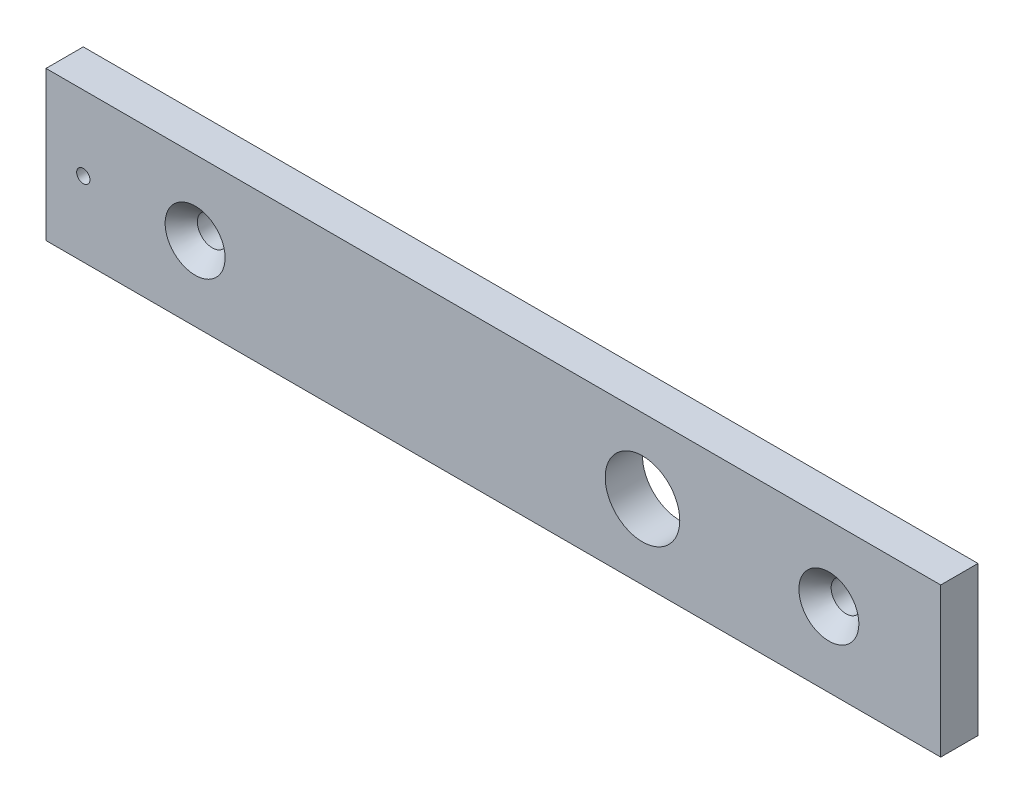
ISO-10303-21;
HEADER;
FILE_DESCRIPTION(('STEP AP214'),'2;1');
FILE_NAME('part.step','',(''),(''),'','','');
FILE_SCHEMA(('AUTOMOTIVE_DESIGN { 1 0 10303 214 1 1 1 1 }'));
ENDSEC;
DATA;
#1=APPLICATION_CONTEXT('core data for automotive mechanical design processes');
#2=APPLICATION_PROTOCOL_DEFINITION('international standard','automotive_design',2000,#1);
#3=PRODUCT_CONTEXT('',#1,'mechanical');
#4=PRODUCT('Part','Part','',(#3));
#5=PRODUCT_RELATED_PRODUCT_CATEGORY('part','',(#4));
#6=PRODUCT_DEFINITION_FORMATION('','',#4);
#7=PRODUCT_DEFINITION_CONTEXT('part definition',#1,'design');
#8=PRODUCT_DEFINITION('design','',#6,#7);
#9=PRODUCT_DEFINITION_SHAPE('','',#8);
#10=(LENGTH_UNIT() NAMED_UNIT(*) SI_UNIT(.MILLI.,.METRE.));
#11=(NAMED_UNIT(*) PLANE_ANGLE_UNIT() SI_UNIT($,.RADIAN.));
#12=(NAMED_UNIT(*) SI_UNIT($,.STERADIAN.) SOLID_ANGLE_UNIT());
#13=UNCERTAINTY_MEASURE_WITH_UNIT(LENGTH_MEASURE(1.E-05),#10,'distance_accuracy_value','');
#14=(GEOMETRIC_REPRESENTATION_CONTEXT(3) GLOBAL_UNCERTAINTY_ASSIGNED_CONTEXT((#13)) GLOBAL_UNIT_ASSIGNED_CONTEXT((#10,
#11,#12)) REPRESENTATION_CONTEXT('',''));
#15=CARTESIAN_POINT('',(0.,0.,0.));
#16=DIRECTION('',(0.,0.,1.));
#17=DIRECTION('',(1.,0.,0.));
#18=AXIS2_PLACEMENT_3D('',#15,#16,#17);
#19=CARTESIAN_POINT('',(-76.2,12.7,6.35));
#20=DIRECTION('',(1.,0.,0.));
#21=DIRECTION('',(0.,0.,-1.));
#22=AXIS2_PLACEMENT_3D('',#19,#20,#21);
#23=PLANE('',#22);
#24=DIRECTION('',(0.,-1.,0.));
#25=VECTOR('',#24,1.);
#26=CARTESIAN_POINT('',(-76.2,12.7,0.));
#27=LINE('',#26,#25);
#28=CARTESIAN_POINT('',(-76.2,12.7,0.));
#29=VERTEX_POINT('',#28);
#30=CARTESIAN_POINT('',(-76.2,-12.7,0.));
#31=VERTEX_POINT('',#30);
#32=EDGE_CURVE('E92',#29,#31,#27,.T.);
#33=ORIENTED_EDGE('',*,*,#32,.T.);
#34=DIRECTION('',(0.,0.,-1.));
#35=VECTOR('',#34,1.);
#36=CARTESIAN_POINT('',(-76.2,-12.7,6.35));
#37=LINE('',#36,#35);
#38=CARTESIAN_POINT('',(-76.2,-12.7,6.35));
#39=VERTEX_POINT('',#38);
#40=EDGE_CURVE('E11',#39,#31,#37,.T.);
#41=ORIENTED_EDGE('',*,*,#40,.F.);
#42=DIRECTION('',(0.,-1.,0.));
#43=VECTOR('',#42,1.);
#44=CARTESIAN_POINT('',(-76.2,12.7,6.35));
#45=LINE('',#44,#43);
#46=CARTESIAN_POINT('',(-76.2,12.7,6.35));
#47=VERTEX_POINT('',#46);
#48=EDGE_CURVE('E103',#47,#39,#45,.T.);
#49=ORIENTED_EDGE('',*,*,#48,.F.);
#50=DIRECTION('',(0.,0.,-1.));
#51=VECTOR('',#50,1.);
#52=CARTESIAN_POINT('',(-76.2,12.7,6.35));
#53=LINE('',#52,#51);
#54=EDGE_CURVE('E108',#47,#29,#53,.T.);
#55=ORIENTED_EDGE('',*,*,#54,.T.);
#56=EDGE_LOOP('',(#33,#41,#49,#55));
#57=FACE_BOUND('',#56,.T.);
#58=ADVANCED_FACE('F31',(#57),#23,.F.);
#59=CARTESIAN_POINT('',(-76.2,-12.7,6.35));
#60=DIRECTION('',(0.,1.,0.));
#61=DIRECTION('',(0.,0.,1.));
#62=AXIS2_PLACEMENT_3D('',#59,#60,#61);
#63=PLANE('',#62);
#64=DIRECTION('',(1.,0.,0.));
#65=VECTOR('',#64,1.);
#66=CARTESIAN_POINT('',(-76.2,-12.7,0.));
#67=LINE('',#66,#65);
#68=CARTESIAN_POINT('',(76.2,-12.7,0.));
#69=VERTEX_POINT('',#68);
#70=EDGE_CURVE('E96',#31,#69,#67,.T.);
#71=ORIENTED_EDGE('',*,*,#70,.T.);
#72=DIRECTION('',(0.,0.,-1.));
#73=VECTOR('',#72,1.);
#74=CARTESIAN_POINT('',(76.2,-12.7,6.35));
#75=LINE('',#74,#73);
#76=CARTESIAN_POINT('',(76.2,-12.7,6.35));
#77=VERTEX_POINT('',#76);
#78=EDGE_CURVE('E39',#77,#69,#75,.T.);
#79=ORIENTED_EDGE('',*,*,#78,.F.);
#80=DIRECTION('',(1.,0.,0.));
#81=VECTOR('',#80,1.);
#82=CARTESIAN_POINT('',(-76.2,-12.7,6.35));
#83=LINE('',#82,#81);
#84=EDGE_CURVE('E78',#39,#77,#83,.T.);
#85=ORIENTED_EDGE('',*,*,#84,.F.);
#86=ORIENTED_EDGE('',*,*,#40,.T.);
#87=EDGE_LOOP('',(#71,#79,#85,#86));
#88=FACE_BOUND('',#87,.T.);
#89=ADVANCED_FACE('F132',(#88),#63,.F.);
#90=CARTESIAN_POINT('',(76.2,12.7,6.35));
#91=DIRECTION('',(-1.,0.,0.));
#92=DIRECTION('',(0.,0.,1.));
#93=AXIS2_PLACEMENT_3D('',#90,#91,#92);
#94=PLANE('',#93);
#95=DIRECTION('',(0.,1.,0.));
#96=VECTOR('',#95,1.);
#97=CARTESIAN_POINT('',(76.2,12.7,0.));
#98=LINE('',#97,#96);
#99=CARTESIAN_POINT('',(76.2,12.7,0.));
#100=VERTEX_POINT('',#99);
#101=EDGE_CURVE('E65',#69,#100,#98,.T.);
#102=ORIENTED_EDGE('',*,*,#101,.T.);
#103=DIRECTION('',(0.,0.,-1.));
#104=VECTOR('',#103,1.);
#105=CARTESIAN_POINT('',(76.2,12.7,6.35));
#106=LINE('',#105,#104);
#107=CARTESIAN_POINT('',(76.2,12.7,6.35));
#108=VERTEX_POINT('',#107);
#109=EDGE_CURVE('E114',#108,#100,#106,.T.);
#110=ORIENTED_EDGE('',*,*,#109,.F.);
#111=DIRECTION('',(0.,1.,0.));
#112=VECTOR('',#111,1.);
#113=CARTESIAN_POINT('',(76.2,12.7,6.35));
#114=LINE('',#113,#112);
#115=EDGE_CURVE('E106',#77,#108,#114,.T.);
#116=ORIENTED_EDGE('',*,*,#115,.F.);
#117=ORIENTED_EDGE('',*,*,#78,.T.);
#118=EDGE_LOOP('',(#102,#110,#116,#117));
#119=FACE_BOUND('',#118,.T.);
#120=ADVANCED_FACE('F116',(#119),#94,.F.);
#121=CARTESIAN_POINT('',(-76.2,12.7,6.35));
#122=DIRECTION('',(0.,-1.,0.));
#123=DIRECTION('',(0.,0.,-1.));
#124=AXIS2_PLACEMENT_3D('',#121,#122,#123);
#125=PLANE('',#124);
#126=DIRECTION('',(-1.,0.,0.));
#127=VECTOR('',#126,1.);
#128=CARTESIAN_POINT('',(-76.2,12.7,0.));
#129=LINE('',#128,#127);
#130=EDGE_CURVE('E71',#100,#29,#129,.T.);
#131=ORIENTED_EDGE('',*,*,#130,.T.);
#132=ORIENTED_EDGE('',*,*,#54,.F.);
#133=DIRECTION('',(-1.,0.,0.));
#134=VECTOR('',#133,1.);
#135=CARTESIAN_POINT('',(-76.2,12.7,6.35));
#136=LINE('',#135,#134);
#137=EDGE_CURVE('E47',#108,#47,#136,.T.);
#138=ORIENTED_EDGE('',*,*,#137,.F.);
#139=ORIENTED_EDGE('',*,*,#109,.T.);
#140=EDGE_LOOP('',(#131,#132,#138,#139));
#141=FACE_BOUND('',#140,.T.);
#142=ADVANCED_FACE('F122',(#141),#125,.F.);
#143=CARTESIAN_POINT('',(-76.2,-12.7,6.35));
#144=DIRECTION('',(0.,0.,1.));
#145=DIRECTION('',(1.,0.,0.));
#146=AXIS2_PLACEMENT_3D('',#143,#144,#145);
#147=PLANE('',#146);
#148=CARTESIAN_POINT('',(-50.8,0.,6.35));
#149=DIRECTION('',(0.,0.,1.));
#150=DIRECTION('',(1.,0.,0.));
#151=AXIS2_PLACEMENT_3D('',#148,#149,#150);
#152=CIRCLE('',#151,5.10667);
#153=CARTESIAN_POINT('',(-45.69333,0.,6.35));
#154=VERTEX_POINT('',#153);
#155=EDGE_CURVE('E237',#154,#154,#152,.T.);
#156=ORIENTED_EDGE('',*,*,#155,.F.);
#157=EDGE_LOOP('',(#156));
#158=FACE_BOUND('',#157,.T.);
#159=CARTESIAN_POINT('',(57.15,0.,6.35));
#160=DIRECTION('',(0.,0.,1.));
#161=DIRECTION('',(1.,0.,0.));
#162=AXIS2_PLACEMENT_3D('',#159,#160,#161);
#163=CIRCLE('',#162,5.10667);
#164=CARTESIAN_POINT('',(62.25667,0.,6.35));
#165=VERTEX_POINT('',#164);
#166=EDGE_CURVE('E244',#165,#165,#163,.T.);
#167=ORIENTED_EDGE('',*,*,#166,.F.);
#168=EDGE_LOOP('',(#167));
#169=FACE_BOUND('',#168,.T.);
#170=CARTESIAN_POINT('',(25.4,0.,6.35));
#171=DIRECTION('',(0.,0.,1.));
#172=DIRECTION('',(1.,0.,0.));
#173=AXIS2_PLACEMENT_3D('',#170,#171,#172);
#174=CIRCLE('',#173,6.34999999999999);
#175=CARTESIAN_POINT('',(31.75,0.,6.35));
#176=VERTEX_POINT('',#175);
#177=EDGE_CURVE('E253',#176,#176,#174,.T.);
#178=ORIENTED_EDGE('',*,*,#177,.F.);
#179=EDGE_LOOP('',(#178));
#180=FACE_BOUND('',#179,.T.);
#181=CARTESIAN_POINT('',(-69.85,0.,6.35));
#182=DIRECTION('',(0.,0.,1.));
#183=DIRECTION('',(1.,0.,0.));
#184=AXIS2_PLACEMENT_3D('',#181,#182,#183);
#185=CIRCLE('',#184,1.13029999999999);
#186=CARTESIAN_POINT('',(-68.7197,0.,6.35));
#187=VERTEX_POINT('',#186);
#188=EDGE_CURVE('E93',#187,#187,#185,.T.);
#189=ORIENTED_EDGE('',*,*,#188,.F.);
#190=EDGE_LOOP('',(#189));
#191=FACE_BOUND('',#190,.T.);
#192=ORIENTED_EDGE('',*,*,#48,.T.);
#193=ORIENTED_EDGE('',*,*,#84,.T.);
#194=ORIENTED_EDGE('',*,*,#115,.T.);
#195=ORIENTED_EDGE('',*,*,#137,.T.);
#196=EDGE_LOOP('',(#192,#193,#194,#195));
#197=FACE_BOUND('',#196,.T.);
#198=ADVANCED_FACE('F124',(#158,#169,#180,#191,#197),#147,.T.);
#199=CARTESIAN_POINT('',(-76.2,-12.7,0.));
#200=DIRECTION('',(0.,0.,1.));
#201=DIRECTION('',(1.,0.,0.));
#202=AXIS2_PLACEMENT_3D('',#199,#200,#201);
#203=PLANE('',#202);
#204=CARTESIAN_POINT('',(-50.8,0.,0.));
#205=DIRECTION('',(0.,0.,1.));
#206=DIRECTION('',(1.,0.,0.));
#207=AXIS2_PLACEMENT_3D('',#204,#205,#206);
#208=CIRCLE('',#207,2.55269999999998);
#209=CARTESIAN_POINT('',(-48.2473,0.,0.));
#210=VERTEX_POINT('',#209);
#211=EDGE_CURVE('E239',#210,#210,#208,.T.);
#212=ORIENTED_EDGE('',*,*,#211,.T.);
#213=EDGE_LOOP('',(#212));
#214=FACE_BOUND('',#213,.T.);
#215=CARTESIAN_POINT('',(57.15,0.,0.));
#216=DIRECTION('',(0.,0.,1.));
#217=DIRECTION('',(1.,0.,0.));
#218=AXIS2_PLACEMENT_3D('',#215,#216,#217);
#219=CIRCLE('',#218,2.55269999999998);
#220=CARTESIAN_POINT('',(59.7027,0.,0.));
#221=VERTEX_POINT('',#220);
#222=EDGE_CURVE('E250',#221,#221,#219,.T.);
#223=ORIENTED_EDGE('',*,*,#222,.T.);
#224=EDGE_LOOP('',(#223));
#225=FACE_BOUND('',#224,.T.);
#226=CARTESIAN_POINT('',(25.4,0.,0.));
#227=DIRECTION('',(0.,0.,1.));
#228=DIRECTION('',(1.,0.,0.));
#229=AXIS2_PLACEMENT_3D('',#226,#227,#228);
#230=CIRCLE('',#229,6.34999999999999);
#231=CARTESIAN_POINT('',(31.75,0.,0.));
#232=VERTEX_POINT('',#231);
#233=EDGE_CURVE('E99',#232,#232,#230,.T.);
#234=ORIENTED_EDGE('',*,*,#233,.T.);
#235=EDGE_LOOP('',(#234));
#236=FACE_BOUND('',#235,.T.);
#237=ORIENTED_EDGE('',*,*,#32,.F.);
#238=ORIENTED_EDGE('',*,*,#130,.F.);
#239=ORIENTED_EDGE('',*,*,#101,.F.);
#240=ORIENTED_EDGE('',*,*,#70,.F.);
#241=EDGE_LOOP('',(#237,#238,#239,#240));
#242=FACE_BOUND('',#241,.T.);
#243=ADVANCED_FACE('F86',(#214,#225,#236,#242),#203,.F.);
#244=CARTESIAN_POINT('',(-69.85,0.,3.048));
#245=DIRECTION('',(0.,0.,1.));
#246=DIRECTION('',(1.,0.,0.));
#247=AXIS2_PLACEMENT_3D('',#244,#245,#246);
#248=CONICAL_SURFACE('',#247,1.1303,1.02974425867665);
#249=CARTESIAN_POINT('',(-69.85,0.,2.36884724231315));
#250=VERTEX_POINT('',#249);
#251=VERTEX_LOOP('',#250);
#252=FACE_BOUND('',#251,.T.);
#253=CARTESIAN_POINT('',(-69.85,0.,3.048));
#254=DIRECTION('',(0.,0.,1.));
#255=DIRECTION('',(1.,0.,0.));
#256=AXIS2_PLACEMENT_3D('',#253,#254,#255);
#257=CIRCLE('',#256,1.1303);
#258=CARTESIAN_POINT('',(-68.7197,0.,3.048));
#259=VERTEX_POINT('',#258);
#260=EDGE_CURVE('E90',#259,#259,#257,.T.);
#261=ORIENTED_EDGE('',*,*,#260,.T.);
#262=EDGE_LOOP('',(#261));
#263=FACE_BOUND('',#262,.T.);
#264=ADVANCED_FACE('F82',(#252,#263),#248,.F.);
#265=CARTESIAN_POINT('',(-69.85,0.,6.35));
#266=DIRECTION('',(0.,0.,1.));
#267=DIRECTION('',(1.,0.,0.));
#268=AXIS2_PLACEMENT_3D('',#265,#266,#267);
#269=CYLINDRICAL_SURFACE('',#268,1.13029999999999);
#270=ORIENTED_EDGE('',*,*,#260,.F.);
#271=EDGE_LOOP('',(#270));
#272=FACE_BOUND('',#271,.T.);
#273=ORIENTED_EDGE('',*,*,#188,.T.);
#274=EDGE_LOOP('',(#273));
#275=FACE_BOUND('',#274,.T.);
#276=ADVANCED_FACE('F85',(#272,#275),#269,.F.);
#277=CARTESIAN_POINT('',(25.4,0.,6.35));
#278=DIRECTION('',(0.,0.,1.));
#279=DIRECTION('',(1.,0.,0.));
#280=AXIS2_PLACEMENT_3D('',#277,#278,#279);
#281=CYLINDRICAL_SURFACE('',#280,6.34999999999999);
#282=ORIENTED_EDGE('',*,*,#233,.F.);
#283=EDGE_LOOP('',(#282));
#284=FACE_BOUND('',#283,.T.);
#285=ORIENTED_EDGE('',*,*,#177,.T.);
#286=EDGE_LOOP('',(#285));
#287=FACE_BOUND('',#286,.T.);
#288=ADVANCED_FACE('F167',(#284,#287),#281,.F.);
#289=CARTESIAN_POINT('',(57.15,0.,6.35));
#290=DIRECTION('',(0.,0.,1.));
#291=DIRECTION('',(1.,0.,0.));
#292=AXIS2_PLACEMENT_3D('',#289,#290,#291);
#293=CYLINDRICAL_SURFACE('',#292,2.55269999999999);
#294=ORIENTED_EDGE('',*,*,#222,.F.);
#295=EDGE_LOOP('',(#294));
#296=FACE_BOUND('',#295,.T.);
#297=CARTESIAN_POINT('',(57.15,0.,3.41199359900975));
#298=DIRECTION('',(0.,0.,1.));
#299=DIRECTION('',(1.,0.,0.));
#300=AXIS2_PLACEMENT_3D('',#297,#298,#299);
#301=CIRCLE('',#300,2.55269999999999);
#302=CARTESIAN_POINT('',(59.7027,0.,3.41199359900975));
#303=VERTEX_POINT('',#302);
#304=EDGE_CURVE('E247',#303,#303,#301,.T.);
#305=ORIENTED_EDGE('',*,*,#304,.T.);
#306=EDGE_LOOP('',(#305));
#307=FACE_BOUND('',#306,.T.);
#308=ADVANCED_FACE('F176',(#296,#307),#293,.F.);
#309=CARTESIAN_POINT('',(57.15,0.,6.35));
#310=DIRECTION('',(0.,0.,1.));
#311=DIRECTION('',(1.,0.,0.));
#312=AXIS2_PLACEMENT_3D('',#309,#310,#311);
#313=CONICAL_SURFACE('',#312,5.10667,0.715584993317676);
#314=ORIENTED_EDGE('',*,*,#304,.F.);
#315=EDGE_LOOP('',(#314));
#316=FACE_BOUND('',#315,.T.);
#317=ORIENTED_EDGE('',*,*,#166,.T.);
#318=EDGE_LOOP('',(#317));
#319=FACE_BOUND('',#318,.T.);
#320=ADVANCED_FACE('F186',(#316,#319),#313,.F.);
#321=CARTESIAN_POINT('',(-50.8,0.,6.35));
#322=DIRECTION('',(0.,0.,1.));
#323=DIRECTION('',(1.,0.,0.));
#324=AXIS2_PLACEMENT_3D('',#321,#322,#323);
#325=CYLINDRICAL_SURFACE('',#324,2.55269999999998);
#326=ORIENTED_EDGE('',*,*,#211,.F.);
#327=EDGE_LOOP('',(#326));
#328=FACE_BOUND('',#327,.T.);
#329=CARTESIAN_POINT('',(-50.8,0.,3.41199359900975));
#330=DIRECTION('',(0.,0.,1.));
#331=DIRECTION('',(1.,0.,0.));
#332=AXIS2_PLACEMENT_3D('',#329,#330,#331);
#333=CIRCLE('',#332,2.55269999999998);
#334=CARTESIAN_POINT('',(-48.2473,0.,3.41199359900975));
#335=VERTEX_POINT('',#334);
#336=EDGE_CURVE('E234',#335,#335,#333,.T.);
#337=ORIENTED_EDGE('',*,*,#336,.T.);
#338=EDGE_LOOP('',(#337));
#339=FACE_BOUND('',#338,.T.);
#340=ADVANCED_FACE('F196',(#328,#339),#325,.F.);
#341=CARTESIAN_POINT('',(-50.8,0.,6.35));
#342=DIRECTION('',(0.,0.,1.));
#343=DIRECTION('',(1.,0.,0.));
#344=AXIS2_PLACEMENT_3D('',#341,#342,#343);
#345=CONICAL_SURFACE('',#344,5.10667,0.715584993317677);
#346=ORIENTED_EDGE('',*,*,#336,.F.);
#347=EDGE_LOOP('',(#346));
#348=FACE_BOUND('',#347,.T.);
#349=ORIENTED_EDGE('',*,*,#155,.T.);
#350=EDGE_LOOP('',(#349));
#351=FACE_BOUND('',#350,.T.);
#352=ADVANCED_FACE('F217',(#348,#351),#345,.F.);
#353=CLOSED_SHELL('',(#58,#89,#120,#142,#198,#243,#264,#276,#288,#308,#320,#340,#352));
#354=MANIFOLD_SOLID_BREP('B2',#353);
#355=ADVANCED_BREP_SHAPE_REPRESENTATION('',(#18,#354),#14);
#356=SHAPE_DEFINITION_REPRESENTATION(#9,#355);
ENDSEC;
END-ISO-10303-21;
